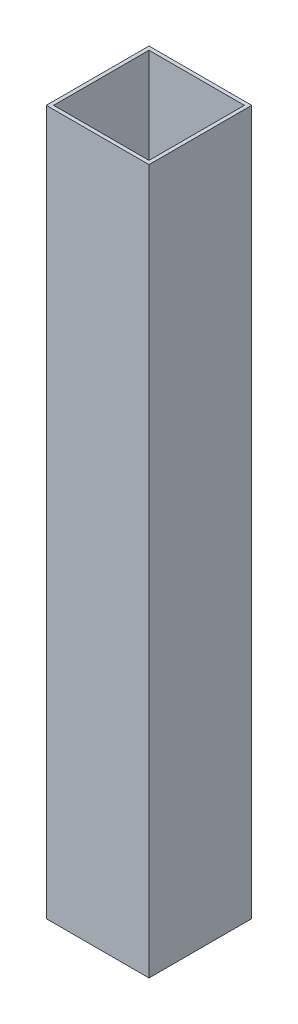
ISO-10303-21;
HEADER;
FILE_DESCRIPTION(('STEP AP214'),'2;1');
FILE_NAME('part.step','',(''),(''),'','','');
FILE_SCHEMA(('AUTOMOTIVE_DESIGN { 1 0 10303 214 1 1 1 1 }'));
ENDSEC;
DATA;
#1=APPLICATION_CONTEXT('core data for automotive mechanical design processes');
#2=APPLICATION_PROTOCOL_DEFINITION('international standard','automotive_design',2000,#1);
#3=PRODUCT_CONTEXT('',#1,'mechanical');
#4=PRODUCT('Part','Part','',(#3));
#5=PRODUCT_RELATED_PRODUCT_CATEGORY('part','',(#4));
#6=PRODUCT_DEFINITION_FORMATION('','',#4);
#7=PRODUCT_DEFINITION_CONTEXT('part definition',#1,'design');
#8=PRODUCT_DEFINITION('design','',#6,#7);
#9=PRODUCT_DEFINITION_SHAPE('','',#8);
#10=(LENGTH_UNIT() NAMED_UNIT(*) SI_UNIT(.MILLI.,.METRE.));
#11=(NAMED_UNIT(*) PLANE_ANGLE_UNIT() SI_UNIT($,.RADIAN.));
#12=(NAMED_UNIT(*) SI_UNIT($,.STERADIAN.) SOLID_ANGLE_UNIT());
#13=UNCERTAINTY_MEASURE_WITH_UNIT(LENGTH_MEASURE(1.E-05),#10,'distance_accuracy_value','');
#14=(GEOMETRIC_REPRESENTATION_CONTEXT(3) GLOBAL_UNCERTAINTY_ASSIGNED_CONTEXT((#13)) GLOBAL_UNIT_ASSIGNED_CONTEXT((#10,
#11,#12)) REPRESENTATION_CONTEXT('',''));
#15=CARTESIAN_POINT('',(0.,0.,0.));
#16=DIRECTION('',(0.,0.,1.));
#17=DIRECTION('',(1.,0.,0.));
#18=AXIS2_PLACEMENT_3D('',#15,#16,#17);
#19=CARTESIAN_POINT('',(0.,304.8,0.));
#20=DIRECTION('',(0.,-1.,0.));
#21=DIRECTION('',(0.,0.,-1.));
#22=AXIS2_PLACEMENT_3D('',#19,#20,#21);
#23=PLANE('',#22);
#24=DIRECTION('',(0.,0.,1.));
#25=VECTOR('',#24,1.);
#26=CARTESIAN_POINT('',(-22.225,304.8,-22.225));
#27=LINE('',#26,#25);
#28=CARTESIAN_POINT('',(-22.225,304.8,-22.225));
#29=VERTEX_POINT('',#28);
#30=CARTESIAN_POINT('',(-22.225,304.8,22.225));
#31=VERTEX_POINT('',#30);
#32=EDGE_CURVE('E159',#29,#31,#27,.T.);
#33=ORIENTED_EDGE('',*,*,#32,.T.);
#34=DIRECTION('',(1.,0.,0.));
#35=VECTOR('',#34,1.);
#36=CARTESIAN_POINT('',(22.225,304.8,22.225));
#37=LINE('',#36,#35);
#38=CARTESIAN_POINT('',(22.225,304.8,22.225));
#39=VERTEX_POINT('',#38);
#40=EDGE_CURVE('E163',#31,#39,#37,.T.);
#41=ORIENTED_EDGE('',*,*,#40,.T.);
#42=DIRECTION('',(0.,0.,-1.));
#43=VECTOR('',#42,1.);
#44=CARTESIAN_POINT('',(22.225,304.8,-22.225));
#45=LINE('',#44,#43);
#46=CARTESIAN_POINT('',(22.225,304.8,-22.225));
#47=VERTEX_POINT('',#46);
#48=EDGE_CURVE('E167',#39,#47,#45,.T.);
#49=ORIENTED_EDGE('',*,*,#48,.T.);
#50=DIRECTION('',(-1.,0.,0.));
#51=VECTOR('',#50,1.);
#52=CARTESIAN_POINT('',(22.225,304.8,-22.225));
#53=LINE('',#52,#51);
#54=EDGE_CURVE('E170',#47,#29,#53,.T.);
#55=ORIENTED_EDGE('',*,*,#54,.T.);
#56=EDGE_LOOP('',(#33,#41,#49,#55));
#57=FACE_BOUND('',#56,.T.);
#58=DIRECTION('',(0.,0.,1.));
#59=VECTOR('',#58,1.);
#60=CARTESIAN_POINT('',(-20.6375,304.8,20.6375));
#61=LINE('',#60,#59);
#62=CARTESIAN_POINT('',(-20.6375,304.8,-20.6375));
#63=VERTEX_POINT('',#62);
#64=CARTESIAN_POINT('',(-20.6375,304.8,20.6375));
#65=VERTEX_POINT('',#64);
#66=EDGE_CURVE('E111',#63,#65,#61,.T.);
#67=ORIENTED_EDGE('',*,*,#66,.F.);
#68=DIRECTION('',(-1.,0.,0.));
#69=VECTOR('',#68,1.);
#70=CARTESIAN_POINT('',(20.6375,304.8,-20.6375));
#71=LINE('',#70,#69);
#72=CARTESIAN_POINT('',(20.6375,304.8,-20.6375));
#73=VERTEX_POINT('',#72);
#74=EDGE_CURVE('E137',#73,#63,#71,.T.);
#75=ORIENTED_EDGE('',*,*,#74,.F.);
#76=DIRECTION('',(0.,0.,-1.));
#77=VECTOR('',#76,1.);
#78=CARTESIAN_POINT('',(20.6375,304.8,20.6375));
#79=LINE('',#78,#77);
#80=CARTESIAN_POINT('',(20.6375,304.8,20.6375));
#81=VERTEX_POINT('',#80);
#82=EDGE_CURVE('E133',#81,#73,#79,.T.);
#83=ORIENTED_EDGE('',*,*,#82,.F.);
#84=DIRECTION('',(1.,0.,0.));
#85=VECTOR('',#84,1.);
#86=CARTESIAN_POINT('',(20.6375,304.8,20.6375));
#87=LINE('',#86,#85);
#88=EDGE_CURVE('E120',#65,#81,#87,.T.);
#89=ORIENTED_EDGE('',*,*,#88,.F.);
#90=EDGE_LOOP('',(#67,#75,#83,#89));
#91=FACE_BOUND('',#90,.T.);
#92=ADVANCED_FACE('F45',(#57,#91),#23,.F.);
#93=CARTESIAN_POINT('',(0.,0.,0.));
#94=DIRECTION('',(0.,-1.,0.));
#95=DIRECTION('',(0.,0.,-1.));
#96=AXIS2_PLACEMENT_3D('',#93,#94,#95);
#97=PLANE('',#96);
#98=DIRECTION('',(0.,0.,1.));
#99=VECTOR('',#98,1.);
#100=CARTESIAN_POINT('',(-22.225,0.,-22.225));
#101=LINE('',#100,#99);
#102=CARTESIAN_POINT('',(-22.225,0.,-22.225));
#103=VERTEX_POINT('',#102);
#104=CARTESIAN_POINT('',(-22.225,0.,22.225));
#105=VERTEX_POINT('',#104);
#106=EDGE_CURVE('E129',#103,#105,#101,.T.);
#107=ORIENTED_EDGE('',*,*,#106,.F.);
#108=DIRECTION('',(-1.,0.,0.));
#109=VECTOR('',#108,1.);
#110=CARTESIAN_POINT('',(22.225,0.,-22.225));
#111=LINE('',#110,#109);
#112=CARTESIAN_POINT('',(22.225,0.,-22.225));
#113=VERTEX_POINT('',#112);
#114=EDGE_CURVE('E164',#113,#103,#111,.T.);
#115=ORIENTED_EDGE('',*,*,#114,.F.);
#116=DIRECTION('',(0.,0.,-1.));
#117=VECTOR('',#116,1.);
#118=CARTESIAN_POINT('',(22.225,0.,-22.225));
#119=LINE('',#118,#117);
#120=CARTESIAN_POINT('',(22.225,0.,22.225));
#121=VERTEX_POINT('',#120);
#122=EDGE_CURVE('E180',#121,#113,#119,.T.);
#123=ORIENTED_EDGE('',*,*,#122,.F.);
#124=DIRECTION('',(1.,0.,0.));
#125=VECTOR('',#124,1.);
#126=CARTESIAN_POINT('',(22.225,0.,22.225));
#127=LINE('',#126,#125);
#128=EDGE_CURVE('E177',#105,#121,#127,.T.);
#129=ORIENTED_EDGE('',*,*,#128,.F.);
#130=EDGE_LOOP('',(#107,#115,#123,#129));
#131=FACE_BOUND('',#130,.T.);
#132=DIRECTION('',(-1.,0.,0.));
#133=VECTOR('',#132,1.);
#134=CARTESIAN_POINT('',(20.6375,0.,-20.6375));
#135=LINE('',#134,#133);
#136=CARTESIAN_POINT('',(20.6375,0.,-20.6375));
#137=VERTEX_POINT('',#136);
#138=CARTESIAN_POINT('',(-20.6375,0.,-20.6375));
#139=VERTEX_POINT('',#138);
#140=EDGE_CURVE('E121',#137,#139,#135,.T.);
#141=ORIENTED_EDGE('',*,*,#140,.T.);
#142=DIRECTION('',(0.,0.,1.));
#143=VECTOR('',#142,1.);
#144=CARTESIAN_POINT('',(-20.6375,0.,20.6375));
#145=LINE('',#144,#143);
#146=CARTESIAN_POINT('',(-20.6375,0.,20.6375));
#147=VERTEX_POINT('',#146);
#148=EDGE_CURVE('E69',#139,#147,#145,.T.);
#149=ORIENTED_EDGE('',*,*,#148,.T.);
#150=DIRECTION('',(1.,0.,0.));
#151=VECTOR('',#150,1.);
#152=CARTESIAN_POINT('',(20.6375,0.,20.6375));
#153=LINE('',#152,#151);
#154=CARTESIAN_POINT('',(20.6375,0.,20.6375));
#155=VERTEX_POINT('',#154);
#156=EDGE_CURVE('E127',#147,#155,#153,.T.);
#157=ORIENTED_EDGE('',*,*,#156,.T.);
#158=DIRECTION('',(0.,0.,-1.));
#159=VECTOR('',#158,1.);
#160=CARTESIAN_POINT('',(20.6375,0.,20.6375));
#161=LINE('',#160,#159);
#162=EDGE_CURVE('E146',#155,#137,#161,.T.);
#163=ORIENTED_EDGE('',*,*,#162,.T.);
#164=EDGE_LOOP('',(#141,#149,#157,#163));
#165=FACE_BOUND('',#164,.T.);
#166=ADVANCED_FACE('F203',(#131,#165),#97,.T.);
#167=CARTESIAN_POINT('',(-22.225,304.8,-22.225));
#168=DIRECTION('',(1.,0.,0.));
#169=DIRECTION('',(0.,0.,-1.));
#170=AXIS2_PLACEMENT_3D('',#167,#168,#169);
#171=PLANE('',#170);
#172=ORIENTED_EDGE('',*,*,#106,.T.);
#173=DIRECTION('',(0.,-1.,0.));
#174=VECTOR('',#173,1.);
#175=CARTESIAN_POINT('',(-22.225,304.8,22.225));
#176=LINE('',#175,#174);
#177=EDGE_CURVE('E11',#31,#105,#176,.T.);
#178=ORIENTED_EDGE('',*,*,#177,.F.);
#179=ORIENTED_EDGE('',*,*,#32,.F.);
#180=DIRECTION('',(0.,-1.,0.));
#181=VECTOR('',#180,1.);
#182=CARTESIAN_POINT('',(-22.225,304.8,-22.225));
#183=LINE('',#182,#181);
#184=EDGE_CURVE('E173',#29,#103,#183,.T.);
#185=ORIENTED_EDGE('',*,*,#184,.T.);
#186=EDGE_LOOP('',(#172,#178,#179,#185));
#187=FACE_BOUND('',#186,.T.);
#188=ADVANCED_FACE('F47',(#187),#171,.F.);
#189=CARTESIAN_POINT('',(22.225,304.8,22.225));
#190=DIRECTION('',(0.,0.,-1.));
#191=DIRECTION('',(-1.,0.,0.));
#192=AXIS2_PLACEMENT_3D('',#189,#190,#191);
#193=PLANE('',#192);
#194=ORIENTED_EDGE('',*,*,#128,.T.);
#195=DIRECTION('',(0.,-1.,0.));
#196=VECTOR('',#195,1.);
#197=CARTESIAN_POINT('',(22.225,304.8,22.225));
#198=LINE('',#197,#196);
#199=EDGE_CURVE('E54',#39,#121,#198,.T.);
#200=ORIENTED_EDGE('',*,*,#199,.F.);
#201=ORIENTED_EDGE('',*,*,#40,.F.);
#202=ORIENTED_EDGE('',*,*,#177,.T.);
#203=EDGE_LOOP('',(#194,#200,#201,#202));
#204=FACE_BOUND('',#203,.T.);
#205=ADVANCED_FACE('F213',(#204),#193,.F.);
#206=CARTESIAN_POINT('',(22.225,304.8,-22.225));
#207=DIRECTION('',(-1.,0.,0.));
#208=DIRECTION('',(0.,0.,1.));
#209=AXIS2_PLACEMENT_3D('',#206,#207,#208);
#210=PLANE('',#209);
#211=ORIENTED_EDGE('',*,*,#122,.T.);
#212=DIRECTION('',(0.,-1.,0.));
#213=VECTOR('',#212,1.);
#214=CARTESIAN_POINT('',(22.225,304.8,-22.225));
#215=LINE('',#214,#213);
#216=EDGE_CURVE('E188',#47,#113,#215,.T.);
#217=ORIENTED_EDGE('',*,*,#216,.F.);
#218=ORIENTED_EDGE('',*,*,#48,.F.);
#219=ORIENTED_EDGE('',*,*,#199,.T.);
#220=EDGE_LOOP('',(#211,#217,#218,#219));
#221=FACE_BOUND('',#220,.T.);
#222=ADVANCED_FACE('F197',(#221),#210,.F.);
#223=CARTESIAN_POINT('',(22.225,304.8,-22.225));
#224=DIRECTION('',(0.,0.,1.));
#225=DIRECTION('',(1.,0.,0.));
#226=AXIS2_PLACEMENT_3D('',#223,#224,#225);
#227=PLANE('',#226);
#228=ORIENTED_EDGE('',*,*,#114,.T.);
#229=ORIENTED_EDGE('',*,*,#184,.F.);
#230=ORIENTED_EDGE('',*,*,#54,.F.);
#231=ORIENTED_EDGE('',*,*,#216,.T.);
#232=EDGE_LOOP('',(#228,#229,#230,#231));
#233=FACE_BOUND('',#232,.T.);
#234=ADVANCED_FACE('F207',(#233),#227,.F.);
#235=CARTESIAN_POINT('',(-20.6375,304.8,20.6375));
#236=DIRECTION('',(1.,0.,0.));
#237=DIRECTION('',(0.,0.,-1.));
#238=AXIS2_PLACEMENT_3D('',#235,#236,#237);
#239=PLANE('',#238);
#240=ORIENTED_EDGE('',*,*,#148,.F.);
#241=DIRECTION('',(0.,-1.,0.));
#242=VECTOR('',#241,1.);
#243=CARTESIAN_POINT('',(-20.6375,304.8,-20.6375));
#244=LINE('',#243,#242);
#245=EDGE_CURVE('E115',#63,#139,#244,.T.);
#246=ORIENTED_EDGE('',*,*,#245,.F.);
#247=ORIENTED_EDGE('',*,*,#66,.T.);
#248=DIRECTION('',(0.,-1.,0.));
#249=VECTOR('',#248,1.);
#250=CARTESIAN_POINT('',(-20.6375,304.8,20.6375));
#251=LINE('',#250,#249);
#252=EDGE_CURVE('E114',#65,#147,#251,.T.);
#253=ORIENTED_EDGE('',*,*,#252,.T.);
#254=EDGE_LOOP('',(#240,#246,#247,#253));
#255=FACE_BOUND('',#254,.T.);
#256=ADVANCED_FACE('F113',(#255),#239,.T.);
#257=CARTESIAN_POINT('',(20.6375,304.8,20.6375));
#258=DIRECTION('',(0.,0.,-1.));
#259=DIRECTION('',(-1.,0.,0.));
#260=AXIS2_PLACEMENT_3D('',#257,#258,#259);
#261=PLANE('',#260);
#262=ORIENTED_EDGE('',*,*,#156,.F.);
#263=ORIENTED_EDGE('',*,*,#252,.F.);
#264=ORIENTED_EDGE('',*,*,#88,.T.);
#265=DIRECTION('',(0.,-1.,0.));
#266=VECTOR('',#265,1.);
#267=CARTESIAN_POINT('',(20.6375,304.8,20.6375));
#268=LINE('',#267,#266);
#269=EDGE_CURVE('E130',#81,#155,#268,.T.);
#270=ORIENTED_EDGE('',*,*,#269,.T.);
#271=EDGE_LOOP('',(#262,#263,#264,#270));
#272=FACE_BOUND('',#271,.T.);
#273=ADVANCED_FACE('F124',(#272),#261,.T.);
#274=CARTESIAN_POINT('',(20.6375,304.8,20.6375));
#275=DIRECTION('',(-1.,0.,0.));
#276=DIRECTION('',(0.,0.,1.));
#277=AXIS2_PLACEMENT_3D('',#274,#275,#276);
#278=PLANE('',#277);
#279=ORIENTED_EDGE('',*,*,#162,.F.);
#280=ORIENTED_EDGE('',*,*,#269,.F.);
#281=ORIENTED_EDGE('',*,*,#82,.T.);
#282=DIRECTION('',(0.,-1.,0.));
#283=VECTOR('',#282,1.);
#284=CARTESIAN_POINT('',(20.6375,304.8,-20.6375));
#285=LINE('',#284,#283);
#286=EDGE_CURVE('E61',#73,#137,#285,.T.);
#287=ORIENTED_EDGE('',*,*,#286,.T.);
#288=EDGE_LOOP('',(#279,#280,#281,#287));
#289=FACE_BOUND('',#288,.T.);
#290=ADVANCED_FACE('F236',(#289),#278,.T.);
#291=CARTESIAN_POINT('',(20.6375,304.8,-20.6375));
#292=DIRECTION('',(0.,0.,1.));
#293=DIRECTION('',(1.,0.,0.));
#294=AXIS2_PLACEMENT_3D('',#291,#292,#293);
#295=PLANE('',#294);
#296=ORIENTED_EDGE('',*,*,#140,.F.);
#297=ORIENTED_EDGE('',*,*,#286,.F.);
#298=ORIENTED_EDGE('',*,*,#74,.T.);
#299=ORIENTED_EDGE('',*,*,#245,.T.);
#300=EDGE_LOOP('',(#296,#297,#298,#299));
#301=FACE_BOUND('',#300,.T.);
#302=ADVANCED_FACE('F240',(#301),#295,.T.);
#303=CLOSED_SHELL('',(#92,#166,#188,#205,#222,#234,#256,#273,#290,#302));
#304=MANIFOLD_SOLID_BREP('B2',#303);
#305=ADVANCED_BREP_SHAPE_REPRESENTATION('',(#18,#304),#14);
#306=SHAPE_DEFINITION_REPRESENTATION(#9,#305);
ENDSEC;
END-ISO-10303-21;
